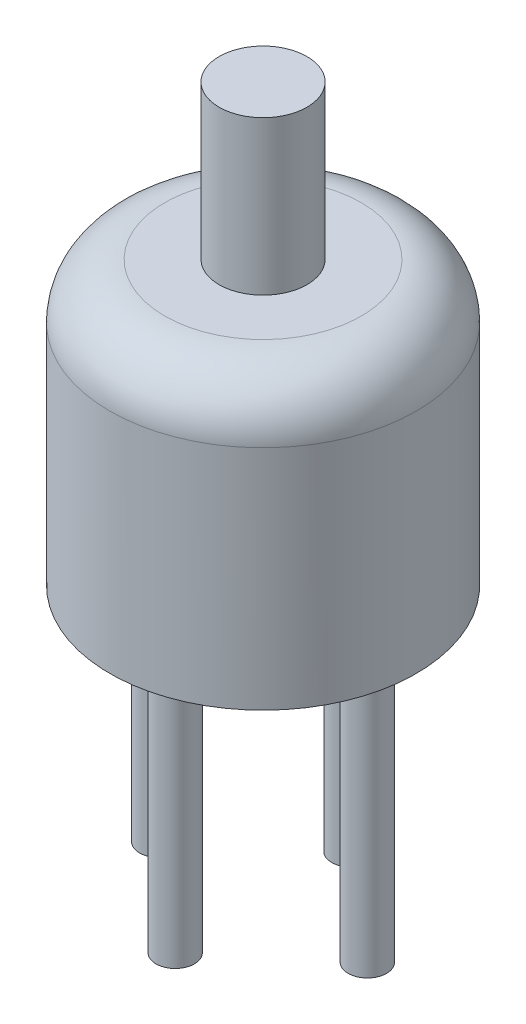
ISO-10303-21;
HEADER;
FILE_DESCRIPTION(('STEP AP214'),'2;1');
FILE_NAME('part.step','',(''),(''),'','','');
FILE_SCHEMA(('AUTOMOTIVE_DESIGN { 1 0 10303 214 1 1 1 1 }'));
ENDSEC;
DATA;
#1=APPLICATION_CONTEXT('core data for automotive mechanical design processes');
#2=APPLICATION_PROTOCOL_DEFINITION('international standard','automotive_design',2000,#1);
#3=PRODUCT_CONTEXT('',#1,'mechanical');
#4=PRODUCT('Part','Part','',(#3));
#5=PRODUCT_RELATED_PRODUCT_CATEGORY('part','',(#4));
#6=PRODUCT_DEFINITION_FORMATION('','',#4);
#7=PRODUCT_DEFINITION_CONTEXT('part definition',#1,'design');
#8=PRODUCT_DEFINITION('design','',#6,#7);
#9=PRODUCT_DEFINITION_SHAPE('','',#8);
#10=(LENGTH_UNIT() NAMED_UNIT(*) SI_UNIT(.MILLI.,.METRE.));
#11=(NAMED_UNIT(*) PLANE_ANGLE_UNIT() SI_UNIT($,.RADIAN.));
#12=(NAMED_UNIT(*) SI_UNIT($,.STERADIAN.) SOLID_ANGLE_UNIT());
#13=UNCERTAINTY_MEASURE_WITH_UNIT(LENGTH_MEASURE(1.E-05),#10,'distance_accuracy_value','');
#14=(GEOMETRIC_REPRESENTATION_CONTEXT(3) GLOBAL_UNCERTAINTY_ASSIGNED_CONTEXT((#13)) GLOBAL_UNIT_ASSIGNED_CONTEXT((#10,
#11,#12)) REPRESENTATION_CONTEXT('',''));
#15=CARTESIAN_POINT('',(0.,0.,0.));
#16=DIRECTION('',(0.,0.,1.));
#17=DIRECTION('',(1.,0.,0.));
#18=AXIS2_PLACEMENT_3D('',#15,#16,#17);
#19=CARTESIAN_POINT('',(0.,25.7,0.));
#20=DIRECTION('',(0.,-1.,0.));
#21=DIRECTION('',(0.,0.,-1.));
#22=AXIS2_PLACEMENT_3D('',#19,#20,#21);
#23=CYLINDRICAL_SURFACE('',#22,13.95);
#24=CARTESIAN_POINT('',(0.,20.7,0.));
#25=DIRECTION('',(0.,1.,0.));
#26=DIRECTION('',(0.,0.,1.));
#27=AXIS2_PLACEMENT_3D('',#24,#25,#26);
#28=CIRCLE('',#27,13.95);
#29=CARTESIAN_POINT('',(0.,20.7,-13.95));
#30=VERTEX_POINT('',#29);
#31=EDGE_CURVE('E72',#30,#30,#28,.F.);
#32=CARTESIAN_POINT('',(0.,0.,0.));
#33=DIRECTION('',(0.,1.,0.));
#34=DIRECTION('',(0.,0.,1.));
#35=AXIS2_PLACEMENT_3D('',#32,#33,#34);
#36=CIRCLE('',#35,13.95);
#37=CARTESIAN_POINT('',(0.,0.,-13.95));
#38=VERTEX_POINT('',#37);
#39=EDGE_CURVE('E80',#38,#38,#36,.T.);
#40=CARTESIAN_POINT('',(0.,20.7,-13.95));
#41=CARTESIAN_POINT('',(0.,20.484375,-13.95));
#42=CARTESIAN_POINT('',(0.,20.26875,-13.95));
#43=CARTESIAN_POINT('',(0.,19.8375,-13.95));
#44=CARTESIAN_POINT('',(0.,19.621875,-13.95));
#45=CARTESIAN_POINT('',(0.,19.190625,-13.95));
#46=CARTESIAN_POINT('',(0.,18.975,-13.95));
#47=CARTESIAN_POINT('',(0.,18.54375,-13.95));
#48=CARTESIAN_POINT('',(0.,18.328125,-13.95));
#49=CARTESIAN_POINT('',(0.,17.896875,-13.95));
#50=CARTESIAN_POINT('',(0.,17.68125,-13.95));
#51=CARTESIAN_POINT('',(0.,17.25,-13.95));
#52=CARTESIAN_POINT('',(0.,17.034375,-13.95));
#53=CARTESIAN_POINT('',(0.,16.603125,-13.95));
#54=CARTESIAN_POINT('',(0.,16.3875,-13.95));
#55=CARTESIAN_POINT('',(0.,15.95625,-13.95));
#56=CARTESIAN_POINT('',(0.,15.740625,-13.95));
#57=CARTESIAN_POINT('',(0.,15.309375,-13.95));
#58=CARTESIAN_POINT('',(0.,15.09375,-13.95));
#59=CARTESIAN_POINT('',(0.,14.6625,-13.95));
#60=CARTESIAN_POINT('',(0.,14.446875,-13.95));
#61=CARTESIAN_POINT('',(0.,14.015625,-13.95));
#62=CARTESIAN_POINT('',(0.,13.8,-13.95));
#63=CARTESIAN_POINT('',(0.,13.36875,-13.95));
#64=CARTESIAN_POINT('',(0.,13.153125,-13.95));
#65=CARTESIAN_POINT('',(0.,12.721875,-13.95));
#66=CARTESIAN_POINT('',(0.,12.50625,-13.95));
#67=CARTESIAN_POINT('',(0.,12.075,-13.95));
#68=CARTESIAN_POINT('',(0.,11.859375,-13.95));
#69=CARTESIAN_POINT('',(0.,11.428125,-13.95));
#70=CARTESIAN_POINT('',(0.,11.2125,-13.95));
#71=CARTESIAN_POINT('',(0.,10.78125,-13.95));
#72=CARTESIAN_POINT('',(0.,10.565625,-13.95));
#73=CARTESIAN_POINT('',(0.,10.134375,-13.95));
#74=CARTESIAN_POINT('',(0.,9.91875,-13.95));
#75=CARTESIAN_POINT('',(0.,9.4875,-13.95));
#76=CARTESIAN_POINT('',(0.,9.271875,-13.95));
#77=CARTESIAN_POINT('',(0.,8.840625,-13.95));
#78=CARTESIAN_POINT('',(0.,8.625,-13.95));
#79=CARTESIAN_POINT('',(0.,8.19375,-13.95));
#80=CARTESIAN_POINT('',(0.,7.978125,-13.95));
#81=CARTESIAN_POINT('',(0.,7.546875,-13.95));
#82=CARTESIAN_POINT('',(0.,7.33125,-13.95));
#83=CARTESIAN_POINT('',(0.,6.9,-13.95));
#84=CARTESIAN_POINT('',(0.,6.684375,-13.95));
#85=CARTESIAN_POINT('',(0.,6.253125,-13.95));
#86=CARTESIAN_POINT('',(0.,6.0375,-13.95));
#87=CARTESIAN_POINT('',(0.,5.60625,-13.95));
#88=CARTESIAN_POINT('',(0.,5.390625,-13.95));
#89=CARTESIAN_POINT('',(0.,4.959375,-13.95));
#90=CARTESIAN_POINT('',(0.,4.74375,-13.95));
#91=CARTESIAN_POINT('',(0.,4.3125,-13.95));
#92=CARTESIAN_POINT('',(0.,4.096875,-13.95));
#93=CARTESIAN_POINT('',(0.,3.665625,-13.95));
#94=CARTESIAN_POINT('',(0.,3.45,-13.95));
#95=CARTESIAN_POINT('',(0.,3.01875,-13.95));
#96=CARTESIAN_POINT('',(0.,2.803125,-13.95));
#97=CARTESIAN_POINT('',(0.,2.371875,-13.95));
#98=CARTESIAN_POINT('',(0.,2.15625,-13.95));
#99=CARTESIAN_POINT('',(0.,1.725,-13.95));
#100=CARTESIAN_POINT('',(0.,1.509375,-13.95));
#101=CARTESIAN_POINT('',(0.,1.078125,-13.95));
#102=CARTESIAN_POINT('',(0.,0.862499999999997,-13.95));
#103=CARTESIAN_POINT('',(0.,0.431249999999998,-13.95));
#104=CARTESIAN_POINT('',(0.,0.215624999999997,-13.95));
#105=CARTESIAN_POINT('',(0.,0.,-13.95));
#106=B_SPLINE_CURVE_WITH_KNOTS('',3,(#40,#41,#42,#43,#44,#45,#46,#47,#48,#49,#50,#51,#52,#53,
#54,#55,#56,#57,#58,#59,#60,#61,#62,#63,#64,#65,#66,#67,#68,#69,#70,#71,#72,#73,#74,#75,#76,#77,
#78,#79,#80,#81,#82,#83,#84,#85,#86,#87,#88,#89,#90,#91,#92,#93,#94,#95,#96,#97,#98,#99,#100,
#101,#102,#103,#104,#105),.UNSPECIFIED.,.F.,.F.,(4,2,2,2,2,2,2,2,2,2,2,2,2,2,2,2,2,2,2,2,2,2,2,
2,2,2,2,2,2,2,2,2,4),(0.,0.646874999999998,1.29375,1.940625,2.5875,3.234375,3.88125,4.528125,
5.175,5.821875,6.46875,7.115625,7.7625,8.409375,9.05625,9.703125,10.35,10.996875,11.64375,
12.290625,12.9375,13.584375,14.23125,14.878125,15.525,16.171875,16.81875,17.465625,18.1125,
18.759375,19.40625,20.053125,20.7),.UNSPECIFIED.);
#107=EDGE_CURVE('BSEAM48',#30,#38,#106,.T.);
#108=ORIENTED_EDGE('',*,*,#31,.T.);
#109=ORIENTED_EDGE('',*,*,#39,.T.);
#110=ORIENTED_EDGE('',*,*,#107,.T.);
#111=ORIENTED_EDGE('',*,*,#107,.F.);
#112=EDGE_LOOP('',(#108,#110,#109,#111));
#113=FACE_BOUND('',#112,.T.);
#114=ADVANCED_FACE('F48',(#113),#23,.T.);
#115=CARTESIAN_POINT('',(0.,25.7,0.));
#116=DIRECTION('',(0.,1.,0.));
#117=DIRECTION('',(0.,0.,1.));
#118=AXIS2_PLACEMENT_3D('',#115,#116,#117);
#119=PLANE('',#118);
#120=CARTESIAN_POINT('',(0.,25.7,0.));
#121=DIRECTION('',(0.,1.,0.));
#122=DIRECTION('',(0.,0.,1.));
#123=AXIS2_PLACEMENT_3D('',#120,#121,#122);
#124=CIRCLE('',#123,4.);
#125=CARTESIAN_POINT('',(0.,25.7,4.));
#126=VERTEX_POINT('',#125);
#127=EDGE_CURVE('E85',#126,#126,#124,.T.);
#128=ORIENTED_EDGE('',*,*,#127,.F.);
#129=EDGE_LOOP('',(#128));
#130=FACE_BOUND('',#129,.T.);
#131=CARTESIAN_POINT('',(0.,25.7,0.));
#132=DIRECTION('',(0.,1.,0.));
#133=DIRECTION('',(0.,0.,1.));
#134=AXIS2_PLACEMENT_3D('',#131,#132,#133);
#135=CIRCLE('',#134,8.95);
#136=CARTESIAN_POINT('',(0.,25.7,8.95));
#137=VERTEX_POINT('',#136);
#138=EDGE_CURVE('E76',#137,#137,#135,.T.);
#139=ORIENTED_EDGE('',*,*,#138,.T.);
#140=EDGE_LOOP('',(#139));
#141=FACE_BOUND('',#140,.T.);
#142=ADVANCED_FACE('F124',(#130,#141),#119,.T.);
#143=CARTESIAN_POINT('',(0.,0.,0.));
#144=DIRECTION('',(0.,1.,0.));
#145=DIRECTION('',(0.,0.,1.));
#146=AXIS2_PLACEMENT_3D('',#143,#144,#145);
#147=PLANE('',#146);
#148=CARTESIAN_POINT('',(0.,0.,-8.));
#149=DIRECTION('',(0.,1.,0.));
#150=DIRECTION('',(0.,0.,1.));
#151=AXIS2_PLACEMENT_3D('',#148,#149,#150);
#152=CIRCLE('',#151,1.75);
#153=CARTESIAN_POINT('',(0.,0.,-6.25));
#154=VERTEX_POINT('',#153);
#155=EDGE_CURVE('E11',#154,#154,#152,.F.);
#156=ORIENTED_EDGE('',*,*,#155,.F.);
#157=EDGE_LOOP('',(#156));
#158=FACE_BOUND('',#157,.T.);
#159=CARTESIAN_POINT('',(9.5,0.,0.));
#160=DIRECTION('',(0.,1.,0.));
#161=DIRECTION('',(0.,0.,1.));
#162=AXIS2_PLACEMENT_3D('',#159,#160,#161);
#163=CIRCLE('',#162,1.75);
#164=CARTESIAN_POINT('',(9.5,0.,1.75));
#165=VERTEX_POINT('',#164);
#166=EDGE_CURVE('E56',#165,#165,#163,.F.);
#167=ORIENTED_EDGE('',*,*,#166,.F.);
#168=EDGE_LOOP('',(#167));
#169=FACE_BOUND('',#168,.T.);
#170=CARTESIAN_POINT('',(-9.5,0.,0.));
#171=DIRECTION('',(0.,1.,0.));
#172=DIRECTION('',(0.,0.,1.));
#173=AXIS2_PLACEMENT_3D('',#170,#171,#172);
#174=CIRCLE('',#173,1.75);
#175=CARTESIAN_POINT('',(-9.5,0.,1.75));
#176=VERTEX_POINT('',#175);
#177=EDGE_CURVE('E61',#176,#176,#174,.F.);
#178=ORIENTED_EDGE('',*,*,#177,.F.);
#179=EDGE_LOOP('',(#178));
#180=FACE_BOUND('',#179,.T.);
#181=CARTESIAN_POINT('',(0.,0.,8.));
#182=DIRECTION('',(0.,1.,0.));
#183=DIRECTION('',(0.,0.,1.));
#184=AXIS2_PLACEMENT_3D('',#181,#182,#183);
#185=CIRCLE('',#184,1.75);
#186=CARTESIAN_POINT('',(0.,0.,9.75));
#187=VERTEX_POINT('',#186);
#188=EDGE_CURVE('E66',#187,#187,#185,.F.);
#189=ORIENTED_EDGE('',*,*,#188,.F.);
#190=EDGE_LOOP('',(#189));
#191=FACE_BOUND('',#190,.T.);
#192=ORIENTED_EDGE('',*,*,#39,.F.);
#193=EDGE_LOOP('',(#192));
#194=FACE_BOUND('',#193,.T.);
#195=ADVANCED_FACE('F129',(#158,#169,#180,#191,#194),#147,.F.);
#196=CARTESIAN_POINT('',(0.,20.7,0.));
#197=DIRECTION('',(0.,1.,0.));
#198=DIRECTION('',(0.,0.,1.));
#199=AXIS2_PLACEMENT_3D('',#196,#197,#198);
#200=TOROIDAL_SURFACE('',#199,8.95,5.);
#201=ORIENTED_EDGE('',*,*,#31,.F.);
#202=EDGE_LOOP('',(#201));
#203=FACE_BOUND('',#202,.T.);
#204=ORIENTED_EDGE('',*,*,#138,.F.);
#205=EDGE_LOOP('',(#204));
#206=FACE_BOUND('',#205,.T.);
#207=ADVANCED_FACE('F50',(#203,#206),#200,.T.);
#208=CARTESIAN_POINT('',(0.,39.7,0.));
#209=DIRECTION('',(0.,-1.,0.));
#210=DIRECTION('',(0.,0.,-1.));
#211=AXIS2_PLACEMENT_3D('',#208,#209,#210);
#212=CYLINDRICAL_SURFACE('',#211,4.);
#213=CARTESIAN_POINT('',(0.,39.7,0.));
#214=DIRECTION('',(0.,1.,0.));
#215=DIRECTION('',(0.,0.,1.));
#216=AXIS2_PLACEMENT_3D('',#213,#214,#215);
#217=CIRCLE('',#216,4.);
#218=CARTESIAN_POINT('',(0.,39.7,4.));
#219=VERTEX_POINT('',#218);
#220=EDGE_CURVE('E84',#219,#219,#217,.T.);
#221=ORIENTED_EDGE('',*,*,#220,.F.);
#222=EDGE_LOOP('',(#221));
#223=FACE_BOUND('',#222,.T.);
#224=ORIENTED_EDGE('',*,*,#127,.T.);
#225=EDGE_LOOP('',(#224));
#226=FACE_BOUND('',#225,.T.);
#227=ADVANCED_FACE('F137',(#223,#226),#212,.T.);
#228=CARTESIAN_POINT('',(0.,39.7,0.));
#229=DIRECTION('',(0.,1.,0.));
#230=DIRECTION('',(0.,0.,1.));
#231=AXIS2_PLACEMENT_3D('',#228,#229,#230);
#232=PLANE('',#231);
#233=ORIENTED_EDGE('',*,*,#220,.T.);
#234=EDGE_LOOP('',(#233));
#235=FACE_BOUND('',#234,.T.);
#236=ADVANCED_FACE('F140',(#235),#232,.T.);
#237=CARTESIAN_POINT('',(0.,-25.,8.));
#238=DIRECTION('',(0.,1.,0.));
#239=DIRECTION('',(0.,0.,1.));
#240=AXIS2_PLACEMENT_3D('',#237,#238,#239);
#241=CYLINDRICAL_SURFACE('',#240,1.75);
#242=CARTESIAN_POINT('',(0.,-25.,8.));
#243=DIRECTION('',(0.,-1.,0.));
#244=DIRECTION('',(0.,0.,-1.));
#245=AXIS2_PLACEMENT_3D('',#242,#243,#244);
#246=CIRCLE('',#245,1.75);
#247=CARTESIAN_POINT('',(0.,-25.,6.25));
#248=VERTEX_POINT('',#247);
#249=EDGE_CURVE('E89',#248,#248,#246,.T.);
#250=ORIENTED_EDGE('',*,*,#249,.F.);
#251=EDGE_LOOP('',(#250));
#252=FACE_BOUND('',#251,.T.);
#253=ORIENTED_EDGE('',*,*,#188,.T.);
#254=EDGE_LOOP('',(#253));
#255=FACE_BOUND('',#254,.T.);
#256=ADVANCED_FACE('F144',(#252,#255),#241,.T.);
#257=CARTESIAN_POINT('',(0.,-25.,0.));
#258=DIRECTION('',(0.,-1.,0.));
#259=DIRECTION('',(0.,0.,-1.));
#260=AXIS2_PLACEMENT_3D('',#257,#258,#259);
#261=PLANE('',#260);
#262=ORIENTED_EDGE('',*,*,#249,.T.);
#263=EDGE_LOOP('',(#262));
#264=FACE_BOUND('',#263,.T.);
#265=ADVANCED_FACE('F148',(#264),#261,.T.);
#266=CARTESIAN_POINT('',(-9.5,-25.,0.));
#267=DIRECTION('',(0.,1.,0.));
#268=DIRECTION('',(0.,0.,1.));
#269=AXIS2_PLACEMENT_3D('',#266,#267,#268);
#270=CYLINDRICAL_SURFACE('',#269,1.75);
#271=CARTESIAN_POINT('',(-9.5,-25.,0.));
#272=DIRECTION('',(0.,-1.,0.));
#273=DIRECTION('',(0.,0.,-1.));
#274=AXIS2_PLACEMENT_3D('',#271,#272,#273);
#275=CIRCLE('',#274,1.75);
#276=CARTESIAN_POINT('',(-9.5,-25.,-1.75));
#277=VERTEX_POINT('',#276);
#278=EDGE_CURVE('E96',#277,#277,#275,.T.);
#279=ORIENTED_EDGE('',*,*,#278,.F.);
#280=EDGE_LOOP('',(#279));
#281=FACE_BOUND('',#280,.T.);
#282=ORIENTED_EDGE('',*,*,#177,.T.);
#283=EDGE_LOOP('',(#282));
#284=FACE_BOUND('',#283,.T.);
#285=ADVANCED_FACE('F152',(#281,#284),#270,.T.);
#286=CARTESIAN_POINT('',(0.,-25.,0.));
#287=DIRECTION('',(0.,-1.,0.));
#288=DIRECTION('',(0.,0.,-1.));
#289=AXIS2_PLACEMENT_3D('',#286,#287,#288);
#290=PLANE('',#289);
#291=ORIENTED_EDGE('',*,*,#278,.T.);
#292=EDGE_LOOP('',(#291));
#293=FACE_BOUND('',#292,.T.);
#294=ADVANCED_FACE('F154',(#293),#290,.T.);
#295=CARTESIAN_POINT('',(9.5,-25.,0.));
#296=DIRECTION('',(0.,1.,0.));
#297=DIRECTION('',(0.,0.,1.));
#298=AXIS2_PLACEMENT_3D('',#295,#296,#297);
#299=CYLINDRICAL_SURFACE('',#298,1.75);
#300=CARTESIAN_POINT('',(9.5,-25.,0.));
#301=DIRECTION('',(0.,-1.,0.));
#302=DIRECTION('',(0.,0.,-1.));
#303=AXIS2_PLACEMENT_3D('',#300,#301,#302);
#304=CIRCLE('',#303,1.75);
#305=CARTESIAN_POINT('',(9.5,-25.,-1.75));
#306=VERTEX_POINT('',#305);
#307=EDGE_CURVE('E100',#306,#306,#304,.T.);
#308=ORIENTED_EDGE('',*,*,#307,.F.);
#309=EDGE_LOOP('',(#308));
#310=FACE_BOUND('',#309,.T.);
#311=ORIENTED_EDGE('',*,*,#166,.T.);
#312=EDGE_LOOP('',(#311));
#313=FACE_BOUND('',#312,.T.);
#314=ADVANCED_FACE('F120',(#310,#313),#299,.T.);
#315=CARTESIAN_POINT('',(0.,-25.,0.));
#316=DIRECTION('',(0.,-1.,0.));
#317=DIRECTION('',(0.,0.,-1.));
#318=AXIS2_PLACEMENT_3D('',#315,#316,#317);
#319=PLANE('',#318);
#320=ORIENTED_EDGE('',*,*,#307,.T.);
#321=EDGE_LOOP('',(#320));
#322=FACE_BOUND('',#321,.T.);
#323=ADVANCED_FACE('F113',(#322),#319,.T.);
#324=CARTESIAN_POINT('',(0.,-25.,-8.));
#325=DIRECTION('',(0.,1.,0.));
#326=DIRECTION('',(0.,0.,1.));
#327=AXIS2_PLACEMENT_3D('',#324,#325,#326);
#328=CYLINDRICAL_SURFACE('',#327,1.75);
#329=ORIENTED_EDGE('',*,*,#155,.T.);
#330=EDGE_LOOP('',(#329));
#331=FACE_BOUND('',#330,.T.);
#332=CARTESIAN_POINT('',(0.,-25.,-8.));
#333=DIRECTION('',(0.,-1.,0.));
#334=DIRECTION('',(0.,0.,-1.));
#335=AXIS2_PLACEMENT_3D('',#332,#333,#334);
#336=CIRCLE('',#335,1.75);
#337=CARTESIAN_POINT('',(0.,-25.,-9.75));
#338=VERTEX_POINT('',#337);
#339=EDGE_CURVE('E104',#338,#338,#336,.T.);
#340=ORIENTED_EDGE('',*,*,#339,.F.);
#341=EDGE_LOOP('',(#340));
#342=FACE_BOUND('',#341,.T.);
#343=ADVANCED_FACE('F111',(#331,#342),#328,.T.);
#344=CARTESIAN_POINT('',(0.,-25.,0.));
#345=DIRECTION('',(0.,-1.,0.));
#346=DIRECTION('',(0.,0.,-1.));
#347=AXIS2_PLACEMENT_3D('',#344,#345,#346);
#348=PLANE('',#347);
#349=ORIENTED_EDGE('',*,*,#339,.T.);
#350=EDGE_LOOP('',(#349));
#351=FACE_BOUND('',#350,.T.);
#352=ADVANCED_FACE('F109',(#351),#348,.T.);
#353=CLOSED_SHELL('',(#114,#142,#195,#207,#227,#236,#256,#265,#285,#294,#314,#323,#343,#352));
#354=MANIFOLD_SOLID_BREP('B2',#353);
#355=ADVANCED_BREP_SHAPE_REPRESENTATION('',(#18,#354),#14);
#356=SHAPE_DEFINITION_REPRESENTATION(#9,#355);
ENDSEC;
END-ISO-10303-21;
